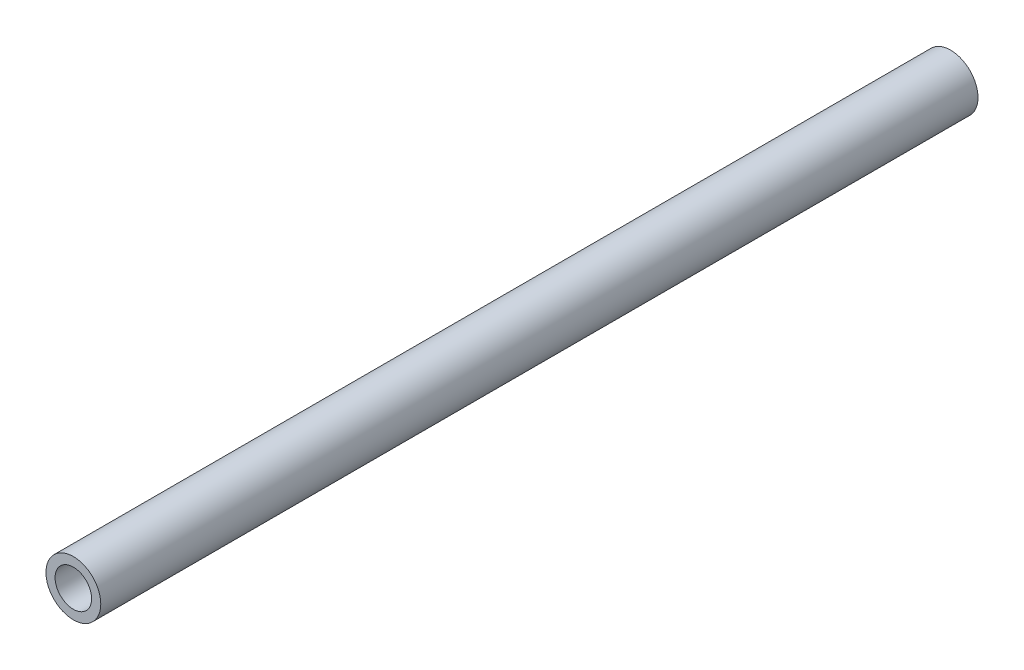
ISO-10303-21;
HEADER;
FILE_DESCRIPTION(('STEP AP214'),'2;1');
FILE_NAME('part.step','',(''),(''),'','','');
FILE_SCHEMA(('AUTOMOTIVE_DESIGN { 1 0 10303 214 1 1 1 1 }'));
ENDSEC;
DATA;
#1=APPLICATION_CONTEXT('core data for automotive mechanical design processes');
#2=APPLICATION_PROTOCOL_DEFINITION('international standard','automotive_design',2000,#1);
#3=PRODUCT_CONTEXT('',#1,'mechanical');
#4=PRODUCT('Part','Part','',(#3));
#5=PRODUCT_RELATED_PRODUCT_CATEGORY('part','',(#4));
#6=PRODUCT_DEFINITION_FORMATION('','',#4);
#7=PRODUCT_DEFINITION_CONTEXT('part definition',#1,'design');
#8=PRODUCT_DEFINITION('design','',#6,#7);
#9=PRODUCT_DEFINITION_SHAPE('','',#8);
#10=(LENGTH_UNIT() NAMED_UNIT(*) SI_UNIT(.MILLI.,.METRE.));
#11=(NAMED_UNIT(*) PLANE_ANGLE_UNIT() SI_UNIT($,.RADIAN.));
#12=(NAMED_UNIT(*) SI_UNIT($,.STERADIAN.) SOLID_ANGLE_UNIT());
#13=UNCERTAINTY_MEASURE_WITH_UNIT(LENGTH_MEASURE(1.E-05),#10,'distance_accuracy_value','');
#14=(GEOMETRIC_REPRESENTATION_CONTEXT(3) GLOBAL_UNCERTAINTY_ASSIGNED_CONTEXT((#13)) GLOBAL_UNIT_ASSIGNED_CONTEXT((#10,
#11,#12)) REPRESENTATION_CONTEXT('',''));
#15=CARTESIAN_POINT('',(0.,0.,0.));
#16=DIRECTION('',(0.,0.,1.));
#17=DIRECTION('',(1.,0.,0.));
#18=AXIS2_PLACEMENT_3D('',#15,#16,#17);
#19=CARTESIAN_POINT('',(0.,0.,96.));
#20=DIRECTION('',(0.,0.,1.));
#21=DIRECTION('',(1.,0.,0.));
#22=AXIS2_PLACEMENT_3D('',#19,#20,#21);
#23=PLANE('',#22);
#24=CARTESIAN_POINT('',(0.,0.,96.));
#25=DIRECTION('',(0.,0.,1.));
#26=DIRECTION('',(1.,0.,0.));
#27=AXIS2_PLACEMENT_3D('',#24,#25,#26);
#28=CIRCLE('',#27,3.);
#29=CARTESIAN_POINT('',(3.,0.,96.));
#30=VERTEX_POINT('',#29);
#31=EDGE_CURVE('E10',#30,#30,#28,.T.);
#32=ORIENTED_EDGE('',*,*,#31,.T.);
#33=EDGE_LOOP('',(#32));
#34=FACE_BOUND('',#33,.T.);
#35=CARTESIAN_POINT('',(0.,0.,96.));
#36=DIRECTION('',(0.,0.,1.));
#37=DIRECTION('',(1.,0.,0.));
#38=AXIS2_PLACEMENT_3D('',#35,#36,#37);
#39=CIRCLE('',#38,2.);
#40=CARTESIAN_POINT('',(2.,0.,96.));
#41=VERTEX_POINT('',#40);
#42=EDGE_CURVE('E47',#41,#41,#39,.T.);
#43=ORIENTED_EDGE('',*,*,#42,.F.);
#44=EDGE_LOOP('',(#43));
#45=FACE_BOUND('',#44,.T.);
#46=ADVANCED_FACE('F36',(#34,#45),#23,.T.);
#47=CARTESIAN_POINT('',(0.,0.,0.));
#48=DIRECTION('',(0.,0.,1.));
#49=DIRECTION('',(1.,0.,0.));
#50=AXIS2_PLACEMENT_3D('',#47,#48,#49);
#51=PLANE('',#50);
#52=CARTESIAN_POINT('',(0.,0.,0.));
#53=DIRECTION('',(0.,0.,1.));
#54=DIRECTION('',(1.,0.,0.));
#55=AXIS2_PLACEMENT_3D('',#52,#53,#54);
#56=CIRCLE('',#55,3.);
#57=CARTESIAN_POINT('',(3.,0.,0.));
#58=VERTEX_POINT('',#57);
#59=EDGE_CURVE('E40',#58,#58,#56,.T.);
#60=ORIENTED_EDGE('',*,*,#59,.F.);
#61=EDGE_LOOP('',(#60));
#62=FACE_BOUND('',#61,.T.);
#63=CARTESIAN_POINT('',(0.,0.,0.));
#64=DIRECTION('',(0.,0.,1.));
#65=DIRECTION('',(1.,0.,0.));
#66=AXIS2_PLACEMENT_3D('',#63,#64,#65);
#67=CIRCLE('',#66,2.);
#68=CARTESIAN_POINT('',(2.,0.,0.));
#69=VERTEX_POINT('',#68);
#70=EDGE_CURVE('E49',#69,#69,#67,.T.);
#71=ORIENTED_EDGE('',*,*,#70,.T.);
#72=EDGE_LOOP('',(#71));
#73=FACE_BOUND('',#72,.T.);
#74=ADVANCED_FACE('F59',(#62,#73),#51,.F.);
#75=CARTESIAN_POINT('',(0.,0.,96.));
#76=DIRECTION('',(0.,0.,-1.));
#77=DIRECTION('',(-1.,0.,0.));
#78=AXIS2_PLACEMENT_3D('',#75,#76,#77);
#79=CYLINDRICAL_SURFACE('',#78,3.);
#80=ORIENTED_EDGE('',*,*,#31,.F.);
#81=EDGE_LOOP('',(#80));
#82=FACE_BOUND('',#81,.T.);
#83=ORIENTED_EDGE('',*,*,#59,.T.);
#84=EDGE_LOOP('',(#83));
#85=FACE_BOUND('',#84,.T.);
#86=ADVANCED_FACE('F38',(#82,#85),#79,.T.);
#87=CARTESIAN_POINT('',(0.,0.,96.));
#88=DIRECTION('',(0.,0.,-1.));
#89=DIRECTION('',(-1.,0.,0.));
#90=AXIS2_PLACEMENT_3D('',#87,#88,#89);
#91=CYLINDRICAL_SURFACE('',#90,2.);
#92=ORIENTED_EDGE('',*,*,#42,.T.);
#93=EDGE_LOOP('',(#92));
#94=FACE_BOUND('',#93,.T.);
#95=ORIENTED_EDGE('',*,*,#70,.F.);
#96=EDGE_LOOP('',(#95));
#97=FACE_BOUND('',#96,.T.);
#98=ADVANCED_FACE('F55',(#94,#97),#91,.F.);
#99=CLOSED_SHELL('',(#46,#74,#86,#98));
#100=MANIFOLD_SOLID_BREP('B2',#99);
#101=ADVANCED_BREP_SHAPE_REPRESENTATION('',(#18,#100),#14);
#102=SHAPE_DEFINITION_REPRESENTATION(#9,#101);
ENDSEC;
END-ISO-10303-21;
